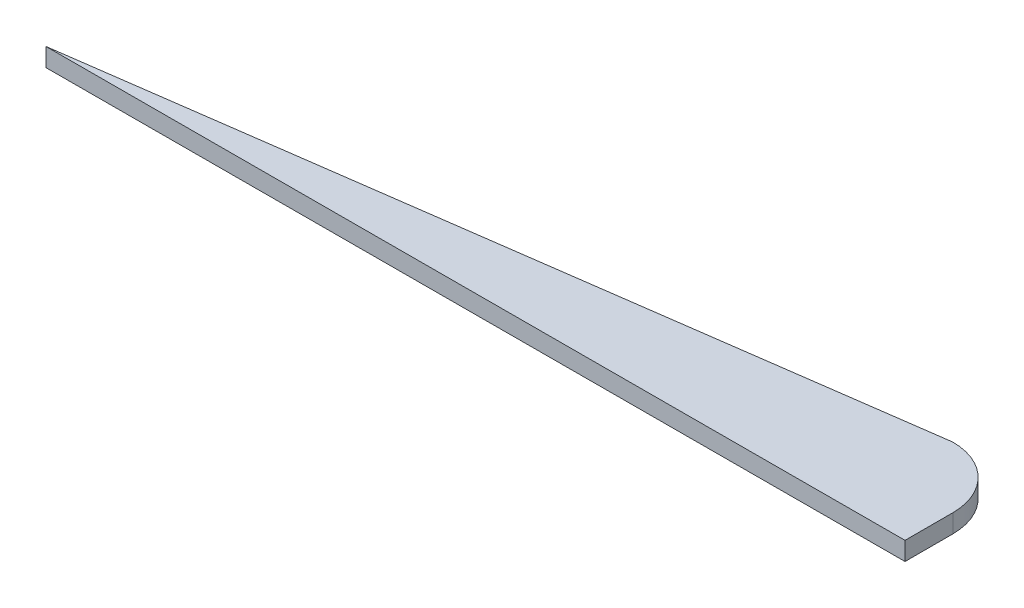
ISO-10303-21;
HEADER;
FILE_DESCRIPTION(('STEP AP214'),'2;1');
FILE_NAME('part.step','',(''),(''),'','','');
FILE_SCHEMA(('AUTOMOTIVE_DESIGN { 1 0 10303 214 1 1 1 1 }'));
ENDSEC;
DATA;
#1=APPLICATION_CONTEXT('core data for automotive mechanical design processes');
#2=APPLICATION_PROTOCOL_DEFINITION('international standard','automotive_design',2000,#1);
#3=PRODUCT_CONTEXT('',#1,'mechanical');
#4=PRODUCT('Part','Part','',(#3));
#5=PRODUCT_RELATED_PRODUCT_CATEGORY('part','',(#4));
#6=PRODUCT_DEFINITION_FORMATION('','',#4);
#7=PRODUCT_DEFINITION_CONTEXT('part definition',#1,'design');
#8=PRODUCT_DEFINITION('design','',#6,#7);
#9=PRODUCT_DEFINITION_SHAPE('','',#8);
#10=(LENGTH_UNIT() NAMED_UNIT(*) SI_UNIT(.MILLI.,.METRE.));
#11=(NAMED_UNIT(*) PLANE_ANGLE_UNIT() SI_UNIT($,.RADIAN.));
#12=(NAMED_UNIT(*) SI_UNIT($,.STERADIAN.) SOLID_ANGLE_UNIT());
#13=UNCERTAINTY_MEASURE_WITH_UNIT(LENGTH_MEASURE(1.E-05),#10,'distance_accuracy_value','');
#14=(GEOMETRIC_REPRESENTATION_CONTEXT(3) GLOBAL_UNCERTAINTY_ASSIGNED_CONTEXT((#13)) GLOBAL_UNIT_ASSIGNED_CONTEXT((#10,
#11,#12)) REPRESENTATION_CONTEXT('',''));
#15=CARTESIAN_POINT('',(0.,0.,0.));
#16=DIRECTION('',(0.,0.,1.));
#17=DIRECTION('',(1.,0.,0.));
#18=AXIS2_PLACEMENT_3D('',#15,#16,#17);
#19=CARTESIAN_POINT('',(19.0375006821521,6.,-27.8432722343372));
#20=DIRECTION('',(0.,-1.,0.));
#21=DIRECTION('',(0.,0.,-1.));
#22=AXIS2_PLACEMENT_3D('',#19,#20,#21);
#23=CYLINDRICAL_SURFACE('',#22,20.);
#24=CARTESIAN_POINT('',(19.0375006821521,0.,-27.8432722343372));
#25=DIRECTION('',(0.,1.,0.));
#26=DIRECTION('',(0.,0.,-1.));
#27=AXIS2_PLACEMENT_3D('',#24,#25,#26);
#28=CIRCLE('',#27,20.);
#29=CARTESIAN_POINT('',(39.0375006821521,0.,-27.8432722343372));
#30=VERTEX_POINT('',#29);
#31=CARTESIAN_POINT('',(19.0375006821521,0.,-47.8432722343372));
#32=VERTEX_POINT('',#31);
#33=EDGE_CURVE('E111',#30,#32,#28,.T.);
#34=ORIENTED_EDGE('',*,*,#33,.T.);
#35=DIRECTION('',(0.,-1.,0.));
#36=VECTOR('',#35,1.);
#37=CARTESIAN_POINT('',(19.0375006821521,6.,-47.8432722343372));
#38=LINE('',#37,#36);
#39=CARTESIAN_POINT('',(19.0375006821521,6.,-47.8432722343372));
#40=VERTEX_POINT('',#39);
#41=EDGE_CURVE('E11',#40,#32,#38,.T.);
#42=ORIENTED_EDGE('',*,*,#41,.F.);
#43=CARTESIAN_POINT('',(19.0375006821521,6.,-27.8432722343372));
#44=DIRECTION('',(0.,1.,0.));
#45=DIRECTION('',(0.,0.,-1.));
#46=AXIS2_PLACEMENT_3D('',#43,#44,#45);
#47=CIRCLE('',#46,20.);
#48=CARTESIAN_POINT('',(39.0375006821521,6.,-27.8432722343372));
#49=VERTEX_POINT('',#48);
#50=EDGE_CURVE('E95',#49,#40,#47,.T.);
#51=ORIENTED_EDGE('',*,*,#50,.F.);
#52=DIRECTION('',(0.,-1.,0.));
#53=VECTOR('',#52,1.);
#54=CARTESIAN_POINT('',(39.0375006821521,6.,-27.8432722343372));
#55=LINE('',#54,#53);
#56=EDGE_CURVE('E107',#49,#30,#55,.T.);
#57=ORIENTED_EDGE('',*,*,#56,.T.);
#58=EDGE_LOOP('',(#34,#42,#51,#57));
#59=FACE_BOUND('',#58,.T.);
#60=ADVANCED_FACE('F43',(#59),#23,.T.);
#61=CARTESIAN_POINT('',(-240.962499317848,6.,-11.6432722343372));
#62=DIRECTION('',(0.13790056929087,0.,0.990446077779731));
#63=DIRECTION('',(0.990446077779732,0.,-0.13790056929087));
#64=AXIS2_PLACEMENT_3D('',#61,#62,#63);
#65=PLANE('',#64);
#66=DIRECTION('',(-0.990446077779731,0.,0.13790056929087));
#67=VECTOR('',#66,1.);
#68=CARTESIAN_POINT('',(-240.962499317848,0.,-11.6432722343372));
#69=LINE('',#68,#67);
#70=CARTESIAN_POINT('',(-240.962499317848,0.,-11.6432722343372));
#71=VERTEX_POINT('',#70);
#72=EDGE_CURVE('E100',#32,#71,#69,.T.);
#73=ORIENTED_EDGE('',*,*,#72,.T.);
#74=DIRECTION('',(0.,-1.,0.));
#75=VECTOR('',#74,1.);
#76=CARTESIAN_POINT('',(-240.962499317848,6.,-11.6432722343372));
#77=LINE('',#76,#75);
#78=CARTESIAN_POINT('',(-240.962499317848,6.,-11.6432722343372));
#79=VERTEX_POINT('',#78);
#80=EDGE_CURVE('E52',#79,#71,#77,.T.);
#81=ORIENTED_EDGE('',*,*,#80,.F.);
#82=DIRECTION('',(-0.990446077779731,0.,0.13790056929087));
#83=VECTOR('',#82,1.);
#84=CARTESIAN_POINT('',(-240.962499317848,6.,-11.6432722343372));
#85=LINE('',#84,#83);
#86=EDGE_CURVE('E90',#40,#79,#85,.T.);
#87=ORIENTED_EDGE('',*,*,#86,.F.);
#88=ORIENTED_EDGE('',*,*,#41,.T.);
#89=EDGE_LOOP('',(#73,#81,#87,#88));
#90=FACE_BOUND('',#89,.T.);
#91=ADVANCED_FACE('F99',(#90),#65,.F.);
#92=CARTESIAN_POINT('',(-240.962499317848,6.,-11.6432722343372));
#93=DIRECTION('',(-0.00214285222304914,0.,-0.99999770408954));
#94=DIRECTION('',(-0.99999770408954,0.,0.00214285222304914));
#95=AXIS2_PLACEMENT_3D('',#92,#93,#94);
#96=PLANE('',#95);
#97=DIRECTION('',(0.999997704089539,0.,-0.00214285222304914));
#98=VECTOR('',#97,1.);
#99=CARTESIAN_POINT('',(-240.962499317848,0.,-11.6432722343372));
#100=LINE('',#99,#98);
#101=CARTESIAN_POINT('',(39.0375006821521,0.,-12.2432722343372));
#102=VERTEX_POINT('',#101);
#103=EDGE_CURVE('E77',#71,#102,#100,.T.);
#104=ORIENTED_EDGE('',*,*,#103,.T.);
#105=DIRECTION('',(0.,-1.,0.));
#106=VECTOR('',#105,1.);
#107=CARTESIAN_POINT('',(39.0375006821521,6.,-12.2432722343372));
#108=LINE('',#107,#106);
#109=CARTESIAN_POINT('',(39.0375006821521,6.,-12.2432722343372));
#110=VERTEX_POINT('',#109);
#111=EDGE_CURVE('E102',#110,#102,#108,.T.);
#112=ORIENTED_EDGE('',*,*,#111,.F.);
#113=DIRECTION('',(0.999997704089539,0.,-0.00214285222304914));
#114=VECTOR('',#113,1.);
#115=CARTESIAN_POINT('',(-240.962499317848,6.,-11.6432722343372));
#116=LINE('',#115,#114);
#117=EDGE_CURVE('E93',#79,#110,#116,.T.);
#118=ORIENTED_EDGE('',*,*,#117,.F.);
#119=ORIENTED_EDGE('',*,*,#80,.T.);
#120=EDGE_LOOP('',(#104,#112,#118,#119));
#121=FACE_BOUND('',#120,.T.);
#122=ADVANCED_FACE('F103',(#121),#96,.F.);
#123=CARTESIAN_POINT('',(39.0375006821521,6.,-12.2432722343372));
#124=DIRECTION('',(-1.,0.,0.));
#125=DIRECTION('',(0.,0.,1.));
#126=AXIS2_PLACEMENT_3D('',#123,#124,#125);
#127=PLANE('',#126);
#128=DIRECTION('',(0.,0.,-1.));
#129=VECTOR('',#128,1.);
#130=CARTESIAN_POINT('',(39.0375006821521,0.,-12.2432722343372));
#131=LINE('',#130,#129);
#132=EDGE_CURVE('E83',#102,#30,#131,.T.);
#133=ORIENTED_EDGE('',*,*,#132,.T.);
#134=ORIENTED_EDGE('',*,*,#56,.F.);
#135=DIRECTION('',(0.,0.,-1.));
#136=VECTOR('',#135,1.);
#137=CARTESIAN_POINT('',(39.0375006821521,6.,-12.2432722343372));
#138=LINE('',#137,#136);
#139=EDGE_CURVE('E60',#110,#49,#138,.T.);
#140=ORIENTED_EDGE('',*,*,#139,.F.);
#141=ORIENTED_EDGE('',*,*,#111,.T.);
#142=EDGE_LOOP('',(#133,#134,#140,#141));
#143=FACE_BOUND('',#142,.T.);
#144=ADVANCED_FACE('F124',(#143),#127,.F.);
#145=CARTESIAN_POINT('',(19.0375006821521,6.,-27.8432722343372));
#146=DIRECTION('',(0.,-1.,0.));
#147=DIRECTION('',(0.,0.,-1.));
#148=AXIS2_PLACEMENT_3D('',#145,#146,#147);
#149=PLANE('',#148);
#150=ORIENTED_EDGE('',*,*,#50,.T.);
#151=ORIENTED_EDGE('',*,*,#86,.T.);
#152=ORIENTED_EDGE('',*,*,#117,.T.);
#153=ORIENTED_EDGE('',*,*,#139,.T.);
#154=EDGE_LOOP('',(#150,#151,#152,#153));
#155=FACE_BOUND('',#154,.T.);
#156=ADVANCED_FACE('F91',(#155),#149,.F.);
#157=CARTESIAN_POINT('',(19.0375006821521,0.,-27.8432722343372));
#158=DIRECTION('',(0.,-1.,0.));
#159=DIRECTION('',(0.,0.,-1.));
#160=AXIS2_PLACEMENT_3D('',#157,#158,#159);
#161=PLANE('',#160);
#162=ORIENTED_EDGE('',*,*,#33,.F.);
#163=ORIENTED_EDGE('',*,*,#132,.F.);
#164=ORIENTED_EDGE('',*,*,#103,.F.);
#165=ORIENTED_EDGE('',*,*,#72,.F.);
#166=EDGE_LOOP('',(#162,#163,#164,#165));
#167=FACE_BOUND('',#166,.T.);
#168=ADVANCED_FACE('F127',(#167),#161,.T.);
#169=CLOSED_SHELL('',(#60,#91,#122,#144,#156,#168));
#170=MANIFOLD_SOLID_BREP('B2',#169);
#171=ADVANCED_BREP_SHAPE_REPRESENTATION('',(#18,#170),#14);
#172=SHAPE_DEFINITION_REPRESENTATION(#9,#171);
ENDSEC;
END-ISO-10303-21;
